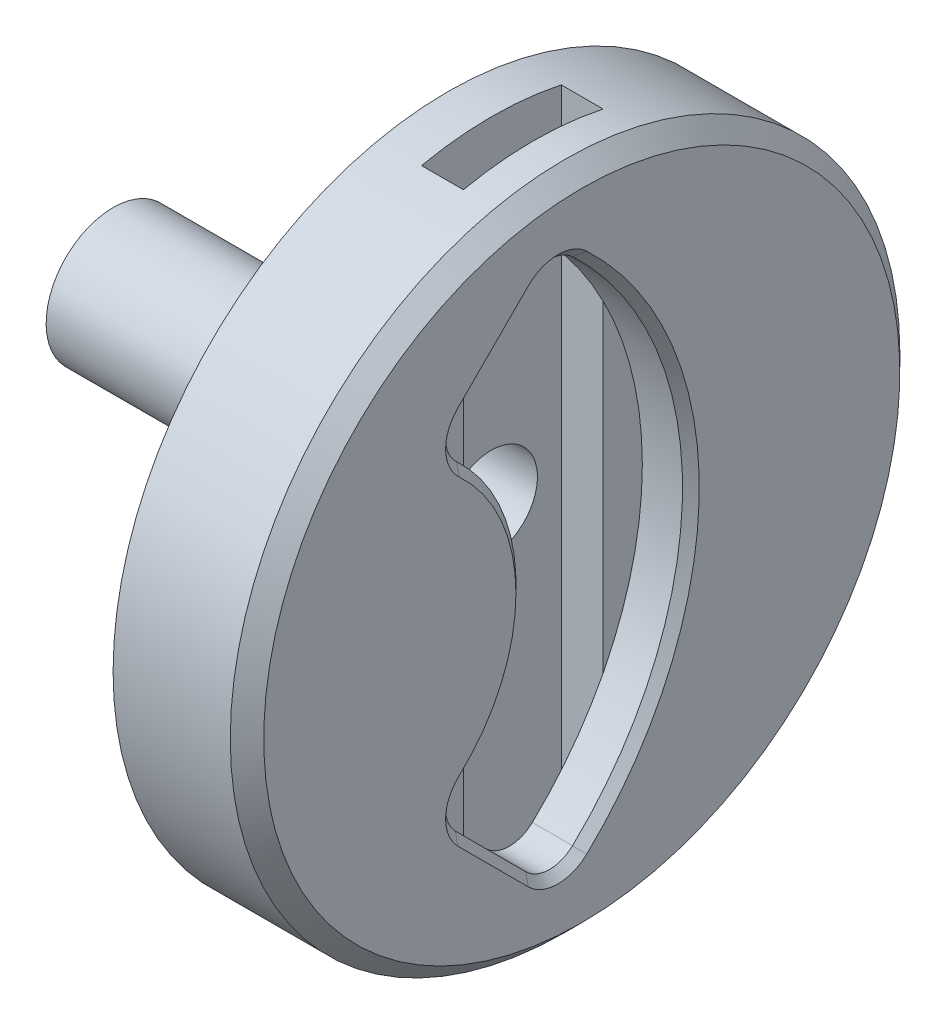
ISO-10303-21;
HEADER;
FILE_DESCRIPTION(('STEP AP214'),'2;1');
FILE_NAME('part.step','',(''),(''),'','','');
FILE_SCHEMA(('AUTOMOTIVE_DESIGN { 1 0 10303 214 1 1 1 1 }'));
ENDSEC;
DATA;
#1=APPLICATION_CONTEXT('core data for automotive mechanical design processes');
#2=APPLICATION_PROTOCOL_DEFINITION('international standard','automotive_design',2000,#1);
#3=PRODUCT_CONTEXT('',#1,'mechanical');
#4=PRODUCT('Part','Part','',(#3));
#5=PRODUCT_RELATED_PRODUCT_CATEGORY('part','',(#4));
#6=PRODUCT_DEFINITION_FORMATION('','',#4);
#7=PRODUCT_DEFINITION_CONTEXT('part definition',#1,'design');
#8=PRODUCT_DEFINITION('design','',#6,#7);
#9=PRODUCT_DEFINITION_SHAPE('','',#8);
#10=(LENGTH_UNIT() NAMED_UNIT(*) SI_UNIT(.MILLI.,.METRE.));
#11=(NAMED_UNIT(*) PLANE_ANGLE_UNIT() SI_UNIT($,.RADIAN.));
#12=(NAMED_UNIT(*) SI_UNIT($,.STERADIAN.) SOLID_ANGLE_UNIT());
#13=UNCERTAINTY_MEASURE_WITH_UNIT(LENGTH_MEASURE(1.E-05),#10,'distance_accuracy_value','');
#14=(GEOMETRIC_REPRESENTATION_CONTEXT(3) GLOBAL_UNCERTAINTY_ASSIGNED_CONTEXT((#13)) GLOBAL_UNIT_ASSIGNED_CONTEXT((#10,
#11,#12)) REPRESENTATION_CONTEXT('',''));
#15=CARTESIAN_POINT('',(0.,0.,0.));
#16=DIRECTION('',(0.,0.,1.));
#17=DIRECTION('',(1.,0.,0.));
#18=AXIS2_PLACEMENT_3D('',#15,#16,#17);
#19=CARTESIAN_POINT('',(5.1,-13.7799052524107,1.42498609336697));
#20=DIRECTION('',(-1.,0.,0.));
#21=DIRECTION('',(0.,-1.,0.));
#22=AXIS2_PLACEMENT_3D('',#19,#20,#21);
#23=PLANE('',#22);
#24=DIRECTION('',(0.,-0.707106781186549,-0.707106781186546));
#25=VECTOR('',#24,1.);
#26=CARTESIAN_POINT('',(5.1,-10.9842892389419,7.04902923158192));
#27=LINE('',#26,#25);
#28=CARTESIAN_POINT('',(5.1,-10.9842892389419,7.04902923158192));
#29=VERTEX_POINT('',#28);
#30=CARTESIAN_POINT('',(5.1,-13.8583184705238,4.175));
#31=VERTEX_POINT('',#30);
#32=EDGE_CURVE('E253',#29,#31,#27,.T.);
#33=ORIENTED_EDGE('',*,*,#32,.T.);
#34=DIRECTION('',(0.,1.,0.));
#35=VECTOR('',#34,1.);
#36=CARTESIAN_POINT('',(5.1,-25.,4.175));
#37=LINE('',#36,#35);
#38=CARTESIAN_POINT('',(5.1,-3.97075586725138,4.175));
#39=VERTEX_POINT('',#38);
#40=EDGE_CURVE('E477',#31,#39,#37,.T.);
#41=ORIENTED_EDGE('',*,*,#40,.T.);
#42=CARTESIAN_POINT('',(5.1,0.,14.4333184705237));
#43=DIRECTION('',(-1.,0.,0.));
#44=DIRECTION('',(0.,-1.,0.));
#45=AXIS2_PLACEMENT_3D('',#42,#43,#44);
#46=CIRCLE('',#45,11.);
#47=CARTESIAN_POINT('',(5.1,-8.09775634171204,6.98843148479573));
#48=VERTEX_POINT('',#47);
#49=EDGE_CURVE('E244',#39,#48,#46,.T.);
#50=ORIENTED_EDGE('',*,*,#49,.T.);
#51=CARTESIAN_POINT('',(5.1,-9.57007567656878,5.63481566920882));
#52=DIRECTION('',(1.,0.,0.));
#53=DIRECTION('',(0.,1.,0.));
#54=AXIS2_PLACEMENT_3D('',#51,#52,#53);
#55=CIRCLE('',#54,2.);
#56=EDGE_CURVE('E249',#48,#29,#55,.T.);
#57=ORIENTED_EDGE('',*,*,#56,.T.);
#58=EDGE_LOOP('',(#33,#41,#50,#57));
#59=FACE_BOUND('',#58,.T.);
#60=ADVANCED_FACE('F47',(#59),#23,.F.);
#61=DIRECTION('',(0.,1.,0.));
#62=VECTOR('',#61,1.);
#63=CARTESIAN_POINT('',(5.1,-25.,-4.175));
#64=LINE('',#63,#62);
#65=CARTESIAN_POINT('',(5.1,-9.62460304114226,-4.175));
#66=VERTEX_POINT('',#65);
#67=CARTESIAN_POINT('',(5.1,9.62460304114226,-4.175));
#68=VERTEX_POINT('',#67);
#69=EDGE_CURVE('E515',#66,#68,#64,.T.);
#70=ORIENTED_EDGE('',*,*,#69,.F.);
#71=CARTESIAN_POINT('',(5.1,0.,14.4333184705237));
#72=DIRECTION('',(1.,0.,0.));
#73=DIRECTION('',(0.,-1.,0.));
#74=AXIS2_PLACEMENT_3D('',#71,#72,#73);
#75=CIRCLE('',#74,20.95);
#76=EDGE_CURVE('E226',#66,#68,#75,.T.);
#77=ORIENTED_EDGE('',*,*,#76,.T.);
#78=EDGE_LOOP('',(#70,#77));
#79=FACE_BOUND('',#78,.T.);
#80=ADVANCED_FACE('F533',(#79),#23,.F.);
#81=CARTESIAN_POINT('',(-20.,0.,0.));
#82=DIRECTION('',(-1.,0.,0.));
#83=DIRECTION('',(0.,-1.,0.));
#84=AXIS2_PLACEMENT_3D('',#81,#82,#83);
#85=PLANE('',#84);
#86=CARTESIAN_POINT('',(-20.,0.,0.));
#87=DIRECTION('',(-1.,0.,0.));
#88=DIRECTION('',(0.,-1.,0.));
#89=AXIS2_PLACEMENT_3D('',#86,#87,#88);
#90=CIRCLE('',#89,1.75);
#91=CARTESIAN_POINT('',(-20.,-1.75,0.));
#92=VERTEX_POINT('',#91);
#93=EDGE_CURVE('E223',#92,#92,#90,.T.);
#94=ORIENTED_EDGE('',*,*,#93,.F.);
#95=EDGE_LOOP('',(#94));
#96=FACE_BOUND('',#95,.T.);
#97=CARTESIAN_POINT('',(-20.,0.,0.));
#98=DIRECTION('',(1.,0.,0.));
#99=DIRECTION('',(0.,1.,0.));
#100=AXIS2_PLACEMENT_3D('',#97,#98,#99);
#101=CIRCLE('',#100,4.);
#102=CARTESIAN_POINT('',(-20.,4.,0.));
#103=VERTEX_POINT('',#102);
#104=EDGE_CURVE('E298',#103,#103,#101,.T.);
#105=ORIENTED_EDGE('',*,*,#104,.F.);
#106=EDGE_LOOP('',(#105));
#107=FACE_BOUND('',#106,.T.);
#108=ADVANCED_FACE('F541',(#96,#107),#85,.T.);
#109=CARTESIAN_POINT('',(8.,0.,0.));
#110=DIRECTION('',(1.,0.,0.));
#111=DIRECTION('',(0.,1.,0.));
#112=AXIS2_PLACEMENT_3D('',#109,#110,#111);
#113=CYLINDRICAL_SURFACE('',#112,4.);
#114=CARTESIAN_POINT('',(-10.,0.,0.));
#115=DIRECTION('',(-1.,0.,0.));
#116=DIRECTION('',(0.,-1.,0.));
#117=AXIS2_PLACEMENT_3D('',#114,#115,#116);
#118=CIRCLE('',#117,4.);
#119=CARTESIAN_POINT('',(-10.,-4.,0.));
#120=VERTEX_POINT('',#119);
#121=EDGE_CURVE('E302',#120,#120,#118,.T.);
#122=ORIENTED_EDGE('',*,*,#121,.T.);
#123=EDGE_LOOP('',(#122));
#124=FACE_BOUND('',#123,.T.);
#125=ORIENTED_EDGE('',*,*,#104,.T.);
#126=EDGE_LOOP('',(#125));
#127=FACE_BOUND('',#126,.T.);
#128=ADVANCED_FACE('F571',(#124,#127),#113,.T.);
#129=CARTESIAN_POINT('',(0.,4.,0.));
#130=DIRECTION('',(-1.,0.,0.));
#131=DIRECTION('',(0.,-1.,0.));
#132=AXIS2_PLACEMENT_3D('',#129,#130,#131);
#133=PLANE('',#132);
#134=CARTESIAN_POINT('',(0.,0.,0.));
#135=DIRECTION('',(-1.,0.,0.));
#136=DIRECTION('',(0.,-1.,0.));
#137=AXIS2_PLACEMENT_3D('',#134,#135,#136);
#138=CIRCLE('',#137,14.);
#139=CARTESIAN_POINT('',(0.,-14.,0.));
#140=VERTEX_POINT('',#139);
#141=EDGE_CURVE('E297',#140,#140,#138,.F.);
#142=ORIENTED_EDGE('',*,*,#141,.T.);
#143=EDGE_LOOP('',(#142));
#144=FACE_BOUND('',#143,.T.);
#145=CARTESIAN_POINT('',(0.,0.,0.));
#146=DIRECTION('',(1.,0.,0.));
#147=DIRECTION('',(0.,1.,0.));
#148=AXIS2_PLACEMENT_3D('',#145,#146,#147);
#149=CIRCLE('',#148,20.);
#150=CARTESIAN_POINT('',(0.,20.,0.));
#151=VERTEX_POINT('',#150);
#152=EDGE_CURVE('E265',#151,#151,#149,.T.);
#153=ORIENTED_EDGE('',*,*,#152,.F.);
#154=EDGE_LOOP('',(#153));
#155=FACE_BOUND('',#154,.T.);
#156=ADVANCED_FACE('F568',(#144,#155),#133,.T.);
#157=CARTESIAN_POINT('',(8.,0.,0.));
#158=DIRECTION('',(1.,0.,0.));
#159=DIRECTION('',(0.,1.,0.));
#160=AXIS2_PLACEMENT_3D('',#157,#158,#159);
#161=CYLINDRICAL_SURFACE('',#160,20.);
#162=DIRECTION('',(1.,0.,0.));
#163=VECTOR('',#162,1.);
#164=CARTESIAN_POINT('',(8.00000000000001,-19.5593807417311,-4.175));
#165=LINE('',#164,#163);
#166=CARTESIAN_POINT('',(2.6,-19.5593807417311,-4.175));
#167=VERTEX_POINT('',#166);
#168=CARTESIAN_POINT('',(5.1,-19.5593807417311,-4.175));
#169=VERTEX_POINT('',#168);
#170=EDGE_CURVE('E195',#167,#169,#165,.T.);
#171=ORIENTED_EDGE('',*,*,#170,.F.);
#172=CARTESIAN_POINT('',(2.6,0.,0.));
#173=DIRECTION('',(-1.,0.,0.));
#174=DIRECTION('',(0.,0.,1.));
#175=AXIS2_PLACEMENT_3D('',#172,#173,#174);
#176=CIRCLE('',#175,20.);
#177=CARTESIAN_POINT('',(2.6,-19.5593807417311,4.175));
#178=VERTEX_POINT('',#177);
#179=EDGE_CURVE('E179',#178,#167,#176,.F.);
#180=ORIENTED_EDGE('',*,*,#179,.F.);
#181=DIRECTION('',(1.,0.,0.));
#182=VECTOR('',#181,1.);
#183=CARTESIAN_POINT('',(8.00000000000001,-19.5593807417311,4.175));
#184=LINE('',#183,#182);
#185=CARTESIAN_POINT('',(5.1,-19.5593807417311,4.175));
#186=VERTEX_POINT('',#185);
#187=EDGE_CURVE('E202',#186,#178,#184,.F.);
#188=ORIENTED_EDGE('',*,*,#187,.F.);
#189=CARTESIAN_POINT('',(5.1,0.,0.));
#190=DIRECTION('',(1.,0.,0.));
#191=DIRECTION('',(0.,0.,-1.));
#192=AXIS2_PLACEMENT_3D('',#189,#190,#191);
#193=CIRCLE('',#192,20.);
#194=EDGE_CURVE('E201',#169,#186,#193,.F.);
#195=ORIENTED_EDGE('',*,*,#194,.F.);
#196=EDGE_LOOP('',(#171,#180,#188,#195));
#197=FACE_BOUND('',#196,.T.);
#198=DIRECTION('',(1.,0.,0.));
#199=VECTOR('',#198,1.);
#200=CARTESIAN_POINT('',(8.,19.5593807417311,-4.175));
#201=LINE('',#200,#199);
#202=CARTESIAN_POINT('',(5.1,19.5593807417311,-4.175));
#203=VERTEX_POINT('',#202);
#204=CARTESIAN_POINT('',(2.6,19.5593807417311,-4.175));
#205=VERTEX_POINT('',#204);
#206=EDGE_CURVE('E196',#203,#205,#201,.F.);
#207=ORIENTED_EDGE('',*,*,#206,.F.);
#208=CARTESIAN_POINT('',(5.1,19.5593807417311,4.175));
#209=VERTEX_POINT('',#208);
#210=EDGE_CURVE('E190',#209,#203,#193,.F.);
#211=ORIENTED_EDGE('',*,*,#210,.F.);
#212=DIRECTION('',(1.,0.,0.));
#213=VECTOR('',#212,1.);
#214=CARTESIAN_POINT('',(8.,19.5593807417311,4.175));
#215=LINE('',#214,#213);
#216=CARTESIAN_POINT('',(2.6,19.5593807417311,4.175));
#217=VERTEX_POINT('',#216);
#218=EDGE_CURVE('E212',#217,#209,#215,.T.);
#219=ORIENTED_EDGE('',*,*,#218,.F.);
#220=EDGE_CURVE('E189',#205,#217,#176,.F.);
#221=ORIENTED_EDGE('',*,*,#220,.F.);
#222=EDGE_LOOP('',(#207,#211,#219,#221));
#223=FACE_BOUND('',#222,.T.);
#224=CARTESIAN_POINT('',(7.,0.,0.));
#225=DIRECTION('',(1.,0.,0.));
#226=DIRECTION('',(0.,1.,0.));
#227=AXIS2_PLACEMENT_3D('',#224,#225,#226);
#228=CIRCLE('',#227,20.);
#229=CARTESIAN_POINT('',(7.,20.,0.));
#230=VERTEX_POINT('',#229);
#231=EDGE_CURVE('E314',#230,#230,#228,.F.);
#232=ORIENTED_EDGE('',*,*,#231,.T.);
#233=EDGE_LOOP('',(#232));
#234=FACE_BOUND('',#233,.T.);
#235=ORIENTED_EDGE('',*,*,#152,.T.);
#236=EDGE_LOOP('',(#235));
#237=FACE_BOUND('',#236,.T.);
#238=ADVANCED_FACE('F203',(#197,#223,#234,#237),#161,.T.);
#239=CARTESIAN_POINT('',(8.,20.,0.));
#240=DIRECTION('',(1.,0.,0.));
#241=DIRECTION('',(0.,1.,0.));
#242=AXIS2_PLACEMENT_3D('',#239,#240,#241);
#243=PLANE('',#242);
#244=CARTESIAN_POINT('',(8.,-9.57007567656878,5.63481566920882));
#245=DIRECTION('',(1.,0.,0.));
#246=DIRECTION('',(0.,1.,0.));
#247=AXIS2_PLACEMENT_3D('',#244,#245,#246);
#248=CIRCLE('',#247,2.5);
#249=CARTESIAN_POINT('',(8.,-11.3378426295351,7.40258262217519));
#250=VERTEX_POINT('',#249);
#251=CARTESIAN_POINT('',(8.,-7.72967650799785,7.32683543869246));
#252=VERTEX_POINT('',#251);
#253=EDGE_CURVE('E342',#250,#252,#248,.F.);
#254=ORIENTED_EDGE('',*,*,#253,.T.);
#255=CARTESIAN_POINT('',(8.,0.,14.4333184705237));
#256=DIRECTION('',(1.,0.,0.));
#257=DIRECTION('',(0.,1.,0.));
#258=AXIS2_PLACEMENT_3D('',#255,#256,#257);
#259=CIRCLE('',#258,10.5);
#260=CARTESIAN_POINT('',(8.,7.72967650799786,7.32683543869246));
#261=VERTEX_POINT('',#260);
#262=EDGE_CURVE('E341',#252,#261,#259,.T.);
#263=ORIENTED_EDGE('',*,*,#262,.T.);
#264=CARTESIAN_POINT('',(8.,9.57007567656878,5.63481566920882));
#265=DIRECTION('',(1.,0.,0.));
#266=DIRECTION('',(0.,1.,0.));
#267=AXIS2_PLACEMENT_3D('',#264,#265,#266);
#268=CIRCLE('',#267,2.5);
#269=CARTESIAN_POINT('',(8.,11.3378426295351,7.4025826221752));
#270=VERTEX_POINT('',#269);
#271=EDGE_CURVE('E336',#261,#270,#268,.F.);
#272=ORIENTED_EDGE('',*,*,#271,.T.);
#273=DIRECTION('',(0.,0.707106781186549,-0.707106781186546));
#274=VECTOR('',#273,1.);
#275=CARTESIAN_POINT('',(8.,15.547672205377,3.19275304633334));
#276=LINE('',#275,#274);
#277=CARTESIAN_POINT('',(8.,15.547672205377,3.19275304633334));
#278=VERTEX_POINT('',#277);
#279=EDGE_CURVE('E335',#270,#278,#276,.T.);
#280=ORIENTED_EDGE('',*,*,#279,.T.);
#281=CARTESIAN_POINT('',(8.,13.7799052524107,1.42498609336697));
#282=DIRECTION('',(1.,0.,0.));
#283=DIRECTION('',(0.,1.,0.));
#284=AXIS2_PLACEMENT_3D('',#281,#282,#283);
#285=CIRCLE('',#284,2.5);
#286=CARTESIAN_POINT('',(8.,15.5978347052353,-0.291152742669542));
#287=VERTEX_POINT('',#286);
#288=EDGE_CURVE('E326',#278,#287,#285,.F.);
#289=ORIENTED_EDGE('',*,*,#288,.T.);
#290=CARTESIAN_POINT('',(8.,0.,14.4333184705237));
#291=DIRECTION('',(1.,0.,0.));
#292=DIRECTION('',(0.,1.,0.));
#293=AXIS2_PLACEMENT_3D('',#290,#291,#292);
#294=CIRCLE('',#293,21.45);
#295=CARTESIAN_POINT('',(8.00000000000001,-15.5978347052353,-0.29115274266955));
#296=VERTEX_POINT('',#295);
#297=EDGE_CURVE('E324',#287,#296,#294,.F.);
#298=ORIENTED_EDGE('',*,*,#297,.T.);
#299=CARTESIAN_POINT('',(8.,-13.7799052524107,1.42498609336697));
#300=DIRECTION('',(1.,0.,0.));
#301=DIRECTION('',(0.,1.,0.));
#302=AXIS2_PLACEMENT_3D('',#299,#300,#301);
#303=CIRCLE('',#302,2.5);
#304=CARTESIAN_POINT('',(8.00000000000001,-15.547672205377,3.19275304633334));
#305=VERTEX_POINT('',#304);
#306=EDGE_CURVE('E328',#296,#305,#303,.F.);
#307=ORIENTED_EDGE('',*,*,#306,.T.);
#308=DIRECTION('',(0.,0.707106781186549,0.707106781186546));
#309=VECTOR('',#308,1.);
#310=CARTESIAN_POINT('',(8.,-11.3378426295351,7.40258262217519));
#311=LINE('',#310,#309);
#312=EDGE_CURVE('E332',#305,#250,#311,.T.);
#313=ORIENTED_EDGE('',*,*,#312,.T.);
#314=EDGE_LOOP('',(#254,#263,#272,#280,#289,#298,#307,#313));
#315=FACE_BOUND('',#314,.T.);
#316=CARTESIAN_POINT('',(8.,0.,0.));
#317=DIRECTION('',(1.,0.,0.));
#318=DIRECTION('',(0.,1.,0.));
#319=AXIS2_PLACEMENT_3D('',#316,#317,#318);
#320=CIRCLE('',#319,19.);
#321=CARTESIAN_POINT('',(8.,19.,0.));
#322=VERTEX_POINT('',#321);
#323=EDGE_CURVE('E308',#322,#322,#320,.T.);
#324=ORIENTED_EDGE('',*,*,#323,.T.);
#325=EDGE_LOOP('',(#324));
#326=FACE_BOUND('',#325,.T.);
#327=ADVANCED_FACE('F401',(#315,#326),#243,.T.);
#328=CARTESIAN_POINT('',(5.1,-13.7799052524107,1.42498609336697));
#329=DIRECTION('',(1.,0.,0.));
#330=DIRECTION('',(0.,1.,0.));
#331=AXIS2_PLACEMENT_3D('',#328,#329,#330);
#332=CYLINDRICAL_SURFACE('',#331,2.);
#333=DIRECTION('',(1.,0.,0.));
#334=VECTOR('',#333,1.);
#335=CARTESIAN_POINT('',(5.1,-15.1941188147837,2.83919965574006));
#336=LINE('',#335,#334);
#337=CARTESIAN_POINT('',(5.1,-15.1941188147837,2.83919965574006));
#338=VERTEX_POINT('',#337);
#339=CARTESIAN_POINT('',(7.49999999999999,-15.1941188147837,2.83919965574006));
#340=VERTEX_POINT('',#339);
#341=EDGE_CURVE('E261',#338,#340,#336,.T.);
#342=ORIENTED_EDGE('',*,*,#341,.T.);
#343=CARTESIAN_POINT('',(7.49999999999999,-13.7799052524107,1.42498609336697));
#344=DIRECTION('',(1.,0.,0.));
#345=DIRECTION('',(0.,0.,-1.));
#346=AXIS2_PLACEMENT_3D('',#343,#344,#345);
#347=CIRCLE('',#346,2.);
#348=CARTESIAN_POINT('',(7.49999999999999,-15.2342488146703,0.0520750245377542));
#349=VERTEX_POINT('',#348);
#350=EDGE_CURVE('E359',#340,#349,#347,.T.);
#351=ORIENTED_EDGE('',*,*,#350,.T.);
#352=DIRECTION('',(1.,0.,0.));
#353=VECTOR('',#352,1.);
#354=CARTESIAN_POINT('',(5.1,-15.2342488146703,0.0520750245377542));
#355=LINE('',#354,#353);
#356=CARTESIAN_POINT('',(5.1,-15.2342488146703,0.0520750245377542));
#357=VERTEX_POINT('',#356);
#358=EDGE_CURVE('E256',#357,#349,#355,.T.);
#359=ORIENTED_EDGE('',*,*,#358,.F.);
#360=CARTESIAN_POINT('',(5.1,-13.7799052524107,1.42498609336697));
#361=DIRECTION('',(1.,0.,0.));
#362=DIRECTION('',(0.,-1.,0.));
#363=AXIS2_PLACEMENT_3D('',#360,#361,#362);
#364=CIRCLE('',#363,2.);
#365=EDGE_CURVE('E222',#338,#357,#364,.T.);
#366=ORIENTED_EDGE('',*,*,#365,.F.);
#367=EDGE_LOOP('',(#342,#351,#359,#366));
#368=FACE_BOUND('',#367,.T.);
#369=ADVANCED_FACE('F448',(#368),#332,.F.);
#370=CARTESIAN_POINT('',(5.1,-10.9842892389419,7.04902923158192));
#371=DIRECTION('',(0.,-0.707106781186546,0.707106781186549));
#372=DIRECTION('',(0.,-0.707106781186549,-0.707106781186546));
#373=AXIS2_PLACEMENT_3D('',#370,#371,#372);
#374=PLANE('',#373);
#375=DIRECTION('',(1.,0.,0.));
#376=VECTOR('',#375,1.);
#377=CARTESIAN_POINT('',(5.1,-10.9842892389419,7.04902923158192));
#378=LINE('',#377,#376);
#379=CARTESIAN_POINT('',(7.49999999999999,-10.9842892389419,7.04902923158192));
#380=VERTEX_POINT('',#379);
#381=EDGE_CURVE('E268',#29,#380,#378,.T.);
#382=ORIENTED_EDGE('',*,*,#381,.T.);
#383=DIRECTION('',(0.,-0.707106781186549,-0.707106781186546));
#384=VECTOR('',#383,1.);
#385=CARTESIAN_POINT('',(7.49999999999999,-15.1941188147837,2.83919965574006));
#386=LINE('',#385,#384);
#387=EDGE_CURVE('E354',#380,#340,#386,.T.);
#388=ORIENTED_EDGE('',*,*,#387,.T.);
#389=ORIENTED_EDGE('',*,*,#341,.F.);
#390=EDGE_CURVE('E258',#31,#338,#27,.T.);
#391=ORIENTED_EDGE('',*,*,#390,.F.);
#392=ORIENTED_EDGE('',*,*,#32,.F.);
#393=EDGE_LOOP('',(#382,#388,#389,#391,#392));
#394=FACE_BOUND('',#393,.T.);
#395=ADVANCED_FACE('F474',(#394),#374,.F.);
#396=CARTESIAN_POINT('',(5.1,-9.57007567656878,5.63481566920882));
#397=DIRECTION('',(1.,0.,0.));
#398=DIRECTION('',(0.,1.,0.));
#399=AXIS2_PLACEMENT_3D('',#396,#397,#398);
#400=CYLINDRICAL_SURFACE('',#399,2.);
#401=DIRECTION('',(1.,0.,0.));
#402=VECTOR('',#401,1.);
#403=CARTESIAN_POINT('',(5.1,-8.09775634171204,6.98843148479573));
#404=LINE('',#403,#402);
#405=CARTESIAN_POINT('',(7.49999999999999,-8.09775634171204,6.98843148479573));
#406=VERTEX_POINT('',#405);
#407=EDGE_CURVE('E267',#48,#406,#404,.T.);
#408=ORIENTED_EDGE('',*,*,#407,.T.);
#409=CARTESIAN_POINT('',(7.49999999999999,-9.57007567656878,5.63481566920882));
#410=DIRECTION('',(1.,0.,0.));
#411=DIRECTION('',(0.,0.,-1.));
#412=AXIS2_PLACEMENT_3D('',#409,#410,#411);
#413=CIRCLE('',#412,2.);
#414=EDGE_CURVE('E349',#406,#380,#413,.T.);
#415=ORIENTED_EDGE('',*,*,#414,.T.);
#416=ORIENTED_EDGE('',*,*,#381,.F.);
#417=ORIENTED_EDGE('',*,*,#56,.F.);
#418=EDGE_LOOP('',(#408,#415,#416,#417));
#419=FACE_BOUND('',#418,.T.);
#420=ADVANCED_FACE('F469',(#419),#400,.F.);
#421=CARTESIAN_POINT('',(5.1,0.,14.4333184705237));
#422=DIRECTION('',(1.,0.,0.));
#423=DIRECTION('',(0.,1.,0.));
#424=AXIS2_PLACEMENT_3D('',#421,#422,#423);
#425=CYLINDRICAL_SURFACE('',#424,11.);
#426=DIRECTION('',(1.,0.,0.));
#427=VECTOR('',#426,1.);
#428=CARTESIAN_POINT('',(5.1,8.09775634171204,6.98843148479573));
#429=LINE('',#428,#427);
#430=CARTESIAN_POINT('',(5.1,8.09775634171204,6.98843148479573));
#431=VERTEX_POINT('',#430);
#432=CARTESIAN_POINT('',(7.49999999999999,8.09775634171204,6.98843148479573));
#433=VERTEX_POINT('',#432);
#434=EDGE_CURVE('E274',#431,#433,#429,.T.);
#435=ORIENTED_EDGE('',*,*,#434,.T.);
#436=CARTESIAN_POINT('',(7.49999999999999,0.,14.4333184705237));
#437=DIRECTION('',(1.,0.,0.));
#438=DIRECTION('',(0.,1.,0.));
#439=AXIS2_PLACEMENT_3D('',#436,#437,#438);
#440=CIRCLE('',#439,11.);
#441=EDGE_CURVE('E316',#433,#406,#440,.F.);
#442=ORIENTED_EDGE('',*,*,#441,.T.);
#443=ORIENTED_EDGE('',*,*,#407,.F.);
#444=ORIENTED_EDGE('',*,*,#49,.F.);
#445=CARTESIAN_POINT('',(5.1,3.97075586725138,4.175));
#446=VERTEX_POINT('',#445);
#447=EDGE_CURVE('E252',#446,#39,#46,.T.);
#448=ORIENTED_EDGE('',*,*,#447,.F.);
#449=EDGE_CURVE('E246',#431,#446,#46,.T.);
#450=ORIENTED_EDGE('',*,*,#449,.F.);
#451=EDGE_LOOP('',(#435,#442,#443,#444,#448,#450));
#452=FACE_BOUND('',#451,.T.);
#453=ADVANCED_FACE('F421',(#452),#425,.T.);
#454=CARTESIAN_POINT('',(5.1,9.57007567656878,5.63481566920882));
#455=DIRECTION('',(1.,0.,0.));
#456=DIRECTION('',(0.,1.,0.));
#457=AXIS2_PLACEMENT_3D('',#454,#455,#456);
#458=CYLINDRICAL_SURFACE('',#457,2.);
#459=DIRECTION('',(1.,0.,0.));
#460=VECTOR('',#459,1.);
#461=CARTESIAN_POINT('',(5.1,10.9842892389419,7.04902923158192));
#462=LINE('',#461,#460);
#463=CARTESIAN_POINT('',(5.1,10.9842892389419,7.04902923158192));
#464=VERTEX_POINT('',#463);
#465=CARTESIAN_POINT('',(7.49999999999999,10.9842892389419,7.04902923158192));
#466=VERTEX_POINT('',#465);
#467=EDGE_CURVE('E279',#464,#466,#462,.T.);
#468=ORIENTED_EDGE('',*,*,#467,.T.);
#469=CARTESIAN_POINT('',(7.49999999999999,9.57007567656878,5.63481566920882));
#470=DIRECTION('',(1.,0.,0.));
#471=DIRECTION('',(0.,0.,-1.));
#472=AXIS2_PLACEMENT_3D('',#469,#470,#471);
#473=CIRCLE('',#472,2.);
#474=EDGE_CURVE('E353',#466,#433,#473,.T.);
#475=ORIENTED_EDGE('',*,*,#474,.T.);
#476=ORIENTED_EDGE('',*,*,#434,.F.);
#477=CARTESIAN_POINT('',(5.1,9.57007567656878,5.63481566920882));
#478=DIRECTION('',(1.,0.,0.));
#479=DIRECTION('',(0.,-1.,0.));
#480=AXIS2_PLACEMENT_3D('',#477,#478,#479);
#481=CIRCLE('',#480,2.);
#482=EDGE_CURVE('E241',#464,#431,#481,.T.);
#483=ORIENTED_EDGE('',*,*,#482,.F.);
#484=EDGE_LOOP('',(#468,#475,#476,#483));
#485=FACE_BOUND('',#484,.T.);
#486=ADVANCED_FACE('F416',(#485),#458,.F.);
#487=CARTESIAN_POINT('',(5.1,15.1941188147837,2.83919965574006));
#488=DIRECTION('',(0.,0.707106781186546,0.707106781186549));
#489=DIRECTION('',(0.,-0.707106781186549,0.707106781186546));
#490=AXIS2_PLACEMENT_3D('',#487,#488,#489);
#491=PLANE('',#490);
#492=DIRECTION('',(1.,0.,0.));
#493=VECTOR('',#492,1.);
#494=CARTESIAN_POINT('',(5.1,15.1941188147837,2.83919965574006));
#495=LINE('',#494,#493);
#496=CARTESIAN_POINT('',(5.1,15.1941188147837,2.83919965574006));
#497=VERTEX_POINT('',#496);
#498=CARTESIAN_POINT('',(7.49999999999999,15.1941188147837,2.83919965574006));
#499=VERTEX_POINT('',#498);
#500=EDGE_CURVE('E282',#497,#499,#495,.T.);
#501=ORIENTED_EDGE('',*,*,#500,.T.);
#502=DIRECTION('',(0.,-0.707106781186549,0.707106781186546));
#503=VECTOR('',#502,1.);
#504=CARTESIAN_POINT('',(7.49999999999999,10.9842892389419,7.04902923158192));
#505=LINE('',#504,#503);
#506=EDGE_CURVE('E357',#499,#466,#505,.T.);
#507=ORIENTED_EDGE('',*,*,#506,.T.);
#508=ORIENTED_EDGE('',*,*,#467,.F.);
#509=DIRECTION('',(0.,-0.707106781186549,0.707106781186546));
#510=VECTOR('',#509,1.);
#511=CARTESIAN_POINT('',(5.1,15.1941188147837,2.83919965574006));
#512=LINE('',#511,#510);
#513=CARTESIAN_POINT('',(5.1,13.8583184705238,4.175));
#514=VERTEX_POINT('',#513);
#515=EDGE_CURVE('E240',#514,#464,#512,.T.);
#516=ORIENTED_EDGE('',*,*,#515,.F.);
#517=EDGE_CURVE('E238',#497,#514,#512,.T.);
#518=ORIENTED_EDGE('',*,*,#517,.F.);
#519=EDGE_LOOP('',(#501,#507,#508,#516,#518));
#520=FACE_BOUND('',#519,.T.);
#521=ADVANCED_FACE('F434',(#520),#491,.F.);
#522=CARTESIAN_POINT('',(5.1,13.7799052524107,1.42498609336697));
#523=DIRECTION('',(1.,0.,0.));
#524=DIRECTION('',(0.,1.,0.));
#525=AXIS2_PLACEMENT_3D('',#522,#523,#524);
#526=CYLINDRICAL_SURFACE('',#525,2.);
#527=DIRECTION('',(1.,0.,0.));
#528=VECTOR('',#527,1.);
#529=CARTESIAN_POINT('',(5.1,15.2342488146704,0.0520750245377594));
#530=LINE('',#529,#528);
#531=CARTESIAN_POINT('',(5.1,15.2342488146704,0.0520750245377594));
#532=VERTEX_POINT('',#531);
#533=CARTESIAN_POINT('',(7.49999999999999,15.2342488146704,0.0520750245377594));
#534=VERTEX_POINT('',#533);
#535=EDGE_CURVE('E288',#532,#534,#530,.T.);
#536=ORIENTED_EDGE('',*,*,#535,.T.);
#537=CARTESIAN_POINT('',(7.49999999999999,13.7799052524107,1.42498609336697));
#538=DIRECTION('',(1.,0.,0.));
#539=DIRECTION('',(0.,0.,-1.));
#540=AXIS2_PLACEMENT_3D('',#537,#538,#539);
#541=CIRCLE('',#540,2.);
#542=EDGE_CURVE('E58',#534,#499,#541,.T.);
#543=ORIENTED_EDGE('',*,*,#542,.T.);
#544=ORIENTED_EDGE('',*,*,#500,.F.);
#545=CARTESIAN_POINT('',(5.1,13.7799052524107,1.42498609336697));
#546=DIRECTION('',(1.,0.,0.));
#547=DIRECTION('',(0.,1.,0.));
#548=AXIS2_PLACEMENT_3D('',#545,#546,#547);
#549=CIRCLE('',#548,2.);
#550=EDGE_CURVE('E231',#532,#497,#549,.T.);
#551=ORIENTED_EDGE('',*,*,#550,.F.);
#552=EDGE_LOOP('',(#536,#543,#544,#551));
#553=FACE_BOUND('',#552,.T.);
#554=ADVANCED_FACE('F437',(#553),#526,.F.);
#555=CARTESIAN_POINT('',(5.1,0.,14.4333184705237));
#556=DIRECTION('',(1.,0.,0.));
#557=DIRECTION('',(0.,1.,0.));
#558=AXIS2_PLACEMENT_3D('',#555,#556,#557);
#559=CYLINDRICAL_SURFACE('',#558,20.95);
#560=ORIENTED_EDGE('',*,*,#358,.T.);
#561=CARTESIAN_POINT('',(7.49999999999999,0.,14.4333184705237));
#562=DIRECTION('',(1.,0.,0.));
#563=DIRECTION('',(0.,1.,0.));
#564=AXIS2_PLACEMENT_3D('',#561,#562,#563);
#565=CIRCLE('',#564,20.95);
#566=EDGE_CURVE('E12',#349,#534,#565,.T.);
#567=ORIENTED_EDGE('',*,*,#566,.T.);
#568=ORIENTED_EDGE('',*,*,#535,.F.);
#569=EDGE_CURVE('E234',#68,#532,#75,.T.);
#570=ORIENTED_EDGE('',*,*,#569,.F.);
#571=ORIENTED_EDGE('',*,*,#76,.F.);
#572=EDGE_CURVE('E230',#357,#66,#75,.T.);
#573=ORIENTED_EDGE('',*,*,#572,.F.);
#574=EDGE_LOOP('',(#560,#567,#568,#570,#571,#573));
#575=FACE_BOUND('',#574,.T.);
#576=ADVANCED_FACE('F442',(#575),#559,.F.);
#577=ORIENTED_EDGE('',*,*,#449,.T.);
#578=EDGE_CURVE('E431',#446,#514,#37,.T.);
#579=ORIENTED_EDGE('',*,*,#578,.T.);
#580=ORIENTED_EDGE('',*,*,#515,.T.);
#581=ORIENTED_EDGE('',*,*,#482,.T.);
#582=EDGE_LOOP('',(#577,#579,#580,#581));
#583=FACE_BOUND('',#582,.T.);
#584=ADVANCED_FACE('F429',(#583),#23,.F.);
#585=CARTESIAN_POINT('',(-10.,0.,0.));
#586=DIRECTION('',(-1.,0.,0.));
#587=DIRECTION('',(0.,-1.,0.));
#588=AXIS2_PLACEMENT_3D('',#585,#586,#587);
#589=TOROIDAL_SURFACE('',#588,14.,10.);
#590=ORIENTED_EDGE('',*,*,#121,.F.);
#591=EDGE_LOOP('',(#590));
#592=FACE_BOUND('',#591,.T.);
#593=ORIENTED_EDGE('',*,*,#141,.F.);
#594=EDGE_LOOP('',(#593));
#595=FACE_BOUND('',#594,.T.);
#596=ADVANCED_FACE('F548',(#592,#595),#589,.F.);
#597=CARTESIAN_POINT('',(8.00100000000001,0.,0.));
#598=DIRECTION('',(-1.,0.,0.));
#599=DIRECTION('',(0.,-1.,0.));
#600=AXIS2_PLACEMENT_3D('',#597,#598,#599);
#601=CYLINDRICAL_SURFACE('',#600,1.75);
#602=CARTESIAN_POINT('',(-17.,0.,0.));
#603=DIRECTION('',(-1.,0.,0.));
#604=DIRECTION('',(0.,-1.,0.));
#605=AXIS2_PLACEMENT_3D('',#602,#603,#604);
#606=CIRCLE('',#605,1.75);
#607=CARTESIAN_POINT('',(-17.,-1.75,0.));
#608=VERTEX_POINT('',#607);
#609=EDGE_CURVE('E218',#608,#608,#606,.F.);
#610=ORIENTED_EDGE('',*,*,#609,.T.);
#611=EDGE_LOOP('',(#610));
#612=FACE_BOUND('',#611,.T.);
#613=ORIENTED_EDGE('',*,*,#93,.T.);
#614=EDGE_LOOP('',(#613));
#615=FACE_BOUND('',#614,.T.);
#616=ADVANCED_FACE('F552',(#612,#615),#601,.F.);
#617=CARTESIAN_POINT('',(-17.,0.,0.));
#618=DIRECTION('',(-1.,0.,0.));
#619=DIRECTION('',(0.,-1.,0.));
#620=AXIS2_PLACEMENT_3D('',#617,#618,#619);
#621=PLANE('',#620);
#622=CARTESIAN_POINT('',(-17.,0.,0.));
#623=DIRECTION('',(-1.,0.,0.));
#624=DIRECTION('',(0.,-1.,0.));
#625=AXIS2_PLACEMENT_3D('',#622,#623,#624);
#626=CIRCLE('',#625,2.75);
#627=CARTESIAN_POINT('',(-17.,-2.75,0.));
#628=VERTEX_POINT('',#627);
#629=EDGE_CURVE('E213',#628,#628,#626,.F.);
#630=ORIENTED_EDGE('',*,*,#629,.T.);
#631=EDGE_LOOP('',(#630));
#632=FACE_BOUND('',#631,.T.);
#633=ORIENTED_EDGE('',*,*,#609,.F.);
#634=EDGE_LOOP('',(#633));
#635=FACE_BOUND('',#634,.T.);
#636=ADVANCED_FACE('F656',(#632,#635),#621,.F.);
#637=CARTESIAN_POINT('',(-27.778174593052,0.,0.));
#638=DIRECTION('',(1.,0.,0.));
#639=DIRECTION('',(0.,1.,0.));
#640=AXIS2_PLACEMENT_3D('',#637,#638,#639);
#641=CYLINDRICAL_SURFACE('',#640,2.75);
#642=CARTESIAN_POINT('',(2.6,0.,0.));
#643=DIRECTION('',(-1.,0.,0.));
#644=DIRECTION('',(0.,0.,1.));
#645=AXIS2_PLACEMENT_3D('',#642,#643,#644);
#646=CIRCLE('',#645,2.75);
#647=CARTESIAN_POINT('',(2.6,0.,2.75));
#648=VERTEX_POINT('',#647);
#649=EDGE_CURVE('E53',#648,#648,#646,.F.);
#650=ORIENTED_EDGE('',*,*,#649,.T.);
#651=EDGE_LOOP('',(#650));
#652=FACE_BOUND('',#651,.T.);
#653=ORIENTED_EDGE('',*,*,#629,.F.);
#654=EDGE_LOOP('',(#653));
#655=FACE_BOUND('',#654,.T.);
#656=ADVANCED_FACE('F583',(#652,#655),#641,.F.);
#657=CARTESIAN_POINT('',(8.,0.,0.));
#658=DIRECTION('',(-1.,0.,0.));
#659=DIRECTION('',(0.,-1.,0.));
#660=AXIS2_PLACEMENT_3D('',#657,#658,#659);
#661=CONICAL_SURFACE('',#660,19.,0.785398163397449);
#662=ORIENTED_EDGE('',*,*,#231,.F.);
#663=EDGE_LOOP('',(#662));
#664=FACE_BOUND('',#663,.T.);
#665=ORIENTED_EDGE('',*,*,#323,.F.);
#666=EDGE_LOOP('',(#665));
#667=FACE_BOUND('',#666,.T.);
#668=ADVANCED_FACE('F578',(#664,#667),#661,.T.);
#669=CARTESIAN_POINT('',(7.49999999999999,0.,14.4333184705237));
#670=DIRECTION('',(1.,0.,0.));
#671=DIRECTION('',(0.,1.,0.));
#672=AXIS2_PLACEMENT_3D('',#669,#670,#671);
#673=CONICAL_SURFACE('',#672,20.95,0.785398163397437);
#674=DIRECTION('',(-0.707106781186554,0.514188097524412,0.485397363367598));
#675=VECTOR('',#674,1.);
#676=CARTESIAN_POINT('',(8.00000000000001,-15.5978347052353,-0.29115274266955));
#677=LINE('',#676,#675);
#678=EDGE_CURVE('E387',#296,#349,#677,.T.);
#679=ORIENTED_EDGE('',*,*,#678,.F.);
#680=ORIENTED_EDGE('',*,*,#297,.F.);
#681=DIRECTION('',(0.707106781186554,0.514188097524414,-0.485397363367596));
#682=VECTOR('',#681,1.);
#683=CARTESIAN_POINT('',(7.49999999999999,15.2342488146704,0.05207502453776));
#684=LINE('',#683,#682);
#685=EDGE_CURVE('E220',#534,#287,#684,.T.);
#686=ORIENTED_EDGE('',*,*,#685,.F.);
#687=ORIENTED_EDGE('',*,*,#566,.F.);
#688=EDGE_LOOP('',(#679,#680,#686,#687));
#689=FACE_BOUND('',#688,.T.);
#690=ADVANCED_FACE('F55',(#689),#673,.F.);
#691=CARTESIAN_POINT('',(7.49999999999999,13.7799052524107,1.42498609336697));
#692=DIRECTION('',(1.,0.,0.));
#693=DIRECTION('',(0.,0.,-1.));
#694=AXIS2_PLACEMENT_3D('',#691,#692,#693);
#695=CONICAL_SURFACE('',#694,2.,0.785398163397439);
#696=ORIENTED_EDGE('',*,*,#685,.T.);
#697=ORIENTED_EDGE('',*,*,#288,.F.);
#698=DIRECTION('',(0.707106781186554,0.499999999999995,0.499999999999996));
#699=VECTOR('',#698,1.);
#700=CARTESIAN_POINT('',(7.49999999999999,15.1941188147837,2.83919965574006));
#701=LINE('',#700,#699);
#702=EDGE_CURVE('E385',#499,#278,#701,.T.);
#703=ORIENTED_EDGE('',*,*,#702,.F.);
#704=ORIENTED_EDGE('',*,*,#542,.F.);
#705=EDGE_LOOP('',(#696,#697,#703,#704));
#706=FACE_BOUND('',#705,.T.);
#707=ADVANCED_FACE('F395',(#706),#695,.F.);
#708=CARTESIAN_POINT('',(7.49999999999999,-13.7799052524107,1.42498609336697));
#709=DIRECTION('',(1.,0.,0.));
#710=DIRECTION('',(0.,0.,-1.));
#711=AXIS2_PLACEMENT_3D('',#708,#709,#710);
#712=CONICAL_SURFACE('',#711,2.,0.785398163397439);
#713=ORIENTED_EDGE('',*,*,#678,.T.);
#714=ORIENTED_EDGE('',*,*,#350,.F.);
#715=DIRECTION('',(-0.707106781186554,0.499999999999996,-0.499999999999995));
#716=VECTOR('',#715,1.);
#717=CARTESIAN_POINT('',(8.00000000000001,-15.547672205377,3.19275304633334));
#718=LINE('',#717,#716);
#719=EDGE_CURVE('E377',#305,#340,#718,.T.);
#720=ORIENTED_EDGE('',*,*,#719,.F.);
#721=ORIENTED_EDGE('',*,*,#306,.F.);
#722=EDGE_LOOP('',(#713,#714,#720,#721));
#723=FACE_BOUND('',#722,.T.);
#724=ADVANCED_FACE('F451',(#723),#712,.F.);
#725=CARTESIAN_POINT('',(7.49999999999999,15.1941188147837,2.83919965574006));
#726=DIRECTION('',(0.707106781186541,-0.500000000000004,-0.500000000000006));
#727=DIRECTION('',(0.,0.707106781186549,-0.707106781186546));
#728=AXIS2_PLACEMENT_3D('',#725,#726,#727);
#729=PLANE('',#728);
#730=ORIENTED_EDGE('',*,*,#702,.T.);
#731=ORIENTED_EDGE('',*,*,#279,.F.);
#732=DIRECTION('',(0.707106781186555,0.499999999999994,0.499999999999995));
#733=VECTOR('',#732,1.);
#734=CARTESIAN_POINT('',(7.49999999999999,10.9842892389419,7.04902923158192));
#735=LINE('',#734,#733);
#736=EDGE_CURVE('E372',#466,#270,#735,.T.);
#737=ORIENTED_EDGE('',*,*,#736,.F.);
#738=ORIENTED_EDGE('',*,*,#506,.F.);
#739=EDGE_LOOP('',(#730,#731,#737,#738));
#740=FACE_BOUND('',#739,.T.);
#741=ADVANCED_FACE('F408',(#740),#729,.T.);
#742=CARTESIAN_POINT('',(7.49999999999999,-10.9842892389419,7.04902923158192));
#743=DIRECTION('',(0.707106781186538,0.500000000000006,-0.500000000000008));
#744=DIRECTION('',(0.,0.707106781186549,0.707106781186546));
#745=AXIS2_PLACEMENT_3D('',#742,#743,#744);
#746=PLANE('',#745);
#747=ORIENTED_EDGE('',*,*,#719,.T.);
#748=ORIENTED_EDGE('',*,*,#387,.F.);
#749=DIRECTION('',(-0.707106781186557,0.499999999999993,-0.499999999999994));
#750=VECTOR('',#749,1.);
#751=CARTESIAN_POINT('',(8.,-11.3378426295351,7.40258262217519));
#752=LINE('',#751,#750);
#753=EDGE_CURVE('E369',#250,#380,#752,.T.);
#754=ORIENTED_EDGE('',*,*,#753,.F.);
#755=ORIENTED_EDGE('',*,*,#312,.F.);
#756=EDGE_LOOP('',(#747,#748,#754,#755));
#757=FACE_BOUND('',#756,.T.);
#758=ADVANCED_FACE('F459',(#757),#746,.T.);
#759=CARTESIAN_POINT('',(7.49999999999999,9.57007567656878,5.63481566920882));
#760=DIRECTION('',(1.,0.,0.));
#761=DIRECTION('',(0.,0.,-1.));
#762=AXIS2_PLACEMENT_3D('',#759,#760,#761);
#763=CONICAL_SURFACE('',#762,2.,0.785398163397437);
#764=ORIENTED_EDGE('',*,*,#736,.T.);
#765=ORIENTED_EDGE('',*,*,#271,.F.);
#766=DIRECTION('',(0.707106781186555,-0.520543492874627,0.478575461161426));
#767=VECTOR('',#766,1.);
#768=CARTESIAN_POINT('',(7.49999999999999,8.09775634171204,6.98843148479573));
#769=LINE('',#768,#767);
#770=EDGE_CURVE('E370',#433,#261,#769,.T.);
#771=ORIENTED_EDGE('',*,*,#770,.F.);
#772=ORIENTED_EDGE('',*,*,#474,.F.);
#773=EDGE_LOOP('',(#764,#765,#771,#772));
#774=FACE_BOUND('',#773,.T.);
#775=ADVANCED_FACE('F413',(#774),#763,.F.);
#776=CARTESIAN_POINT('',(7.49999999999999,-9.57007567656878,5.63481566920882));
#777=DIRECTION('',(1.,0.,0.));
#778=DIRECTION('',(0.,0.,-1.));
#779=AXIS2_PLACEMENT_3D('',#776,#777,#778);
#780=CONICAL_SURFACE('',#779,2.,0.785398163397438);
#781=ORIENTED_EDGE('',*,*,#753,.T.);
#782=ORIENTED_EDGE('',*,*,#414,.F.);
#783=DIRECTION('',(-0.707106781186554,-0.520543492874626,-0.478575461161428));
#784=VECTOR('',#783,1.);
#785=CARTESIAN_POINT('',(8.,-7.72967650799785,7.32683543869246));
#786=LINE('',#785,#784);
#787=EDGE_CURVE('E209',#252,#406,#786,.T.);
#788=ORIENTED_EDGE('',*,*,#787,.F.);
#789=ORIENTED_EDGE('',*,*,#253,.F.);
#790=EDGE_LOOP('',(#781,#782,#788,#789));
#791=FACE_BOUND('',#790,.T.);
#792=ADVANCED_FACE('F470',(#791),#780,.F.);
#793=CARTESIAN_POINT('',(7.49999999999999,0.,14.4333184705237));
#794=DIRECTION('',(-1.,0.,0.));
#795=DIRECTION('',(0.,-1.,0.));
#796=AXIS2_PLACEMENT_3D('',#793,#794,#795);
#797=CONICAL_SURFACE('',#796,11.,0.785398163397437);
#798=ORIENTED_EDGE('',*,*,#770,.T.);
#799=ORIENTED_EDGE('',*,*,#262,.F.);
#800=ORIENTED_EDGE('',*,*,#787,.T.);
#801=ORIENTED_EDGE('',*,*,#441,.F.);
#802=EDGE_LOOP('',(#798,#799,#800,#801));
#803=FACE_BOUND('',#802,.T.);
#804=ADVANCED_FACE('F462',(#803),#797,.T.);
#805=CARTESIAN_POINT('',(5.1,-25.,4.175));
#806=DIRECTION('',(1.,0.,0.));
#807=DIRECTION('',(0.,0.,-1.));
#808=AXIS2_PLACEMENT_3D('',#805,#806,#807);
#809=PLANE('',#808);
#810=ORIENTED_EDGE('',*,*,#569,.T.);
#811=ORIENTED_EDGE('',*,*,#550,.T.);
#812=ORIENTED_EDGE('',*,*,#517,.T.);
#813=EDGE_CURVE('E500',#514,#209,#37,.T.);
#814=ORIENTED_EDGE('',*,*,#813,.T.);
#815=ORIENTED_EDGE('',*,*,#210,.T.);
#816=EDGE_CURVE('E511',#68,#203,#64,.T.);
#817=ORIENTED_EDGE('',*,*,#816,.F.);
#818=EDGE_LOOP('',(#810,#811,#812,#814,#815,#817));
#819=FACE_BOUND('',#818,.T.);
#820=ADVANCED_FACE('F499',(#819),#809,.F.);
#821=ORIENTED_EDGE('',*,*,#447,.T.);
#822=EDGE_CURVE('E518',#39,#446,#37,.T.);
#823=ORIENTED_EDGE('',*,*,#822,.T.);
#824=EDGE_LOOP('',(#821,#823));
#825=FACE_BOUND('',#824,.T.);
#826=ADVANCED_FACE('F525',(#825),#809,.F.);
#827=ORIENTED_EDGE('',*,*,#572,.T.);
#828=EDGE_CURVE('E507',#169,#66,#64,.T.);
#829=ORIENTED_EDGE('',*,*,#828,.F.);
#830=ORIENTED_EDGE('',*,*,#194,.T.);
#831=EDGE_CURVE('E503',#186,#31,#37,.T.);
#832=ORIENTED_EDGE('',*,*,#831,.T.);
#833=ORIENTED_EDGE('',*,*,#390,.T.);
#834=ORIENTED_EDGE('',*,*,#365,.T.);
#835=EDGE_LOOP('',(#827,#829,#830,#832,#833,#834));
#836=FACE_BOUND('',#835,.T.);
#837=ADVANCED_FACE('F530',(#836),#809,.F.);
#838=CARTESIAN_POINT('',(2.6,-25.,-4.175));
#839=DIRECTION('',(-1.,0.,0.));
#840=DIRECTION('',(0.,0.,1.));
#841=AXIS2_PLACEMENT_3D('',#838,#839,#840);
#842=PLANE('',#841);
#843=ORIENTED_EDGE('',*,*,#179,.T.);
#844=DIRECTION('',(0.,1.,0.));
#845=VECTOR('',#844,1.);
#846=CARTESIAN_POINT('',(2.6,-25.,-4.175));
#847=LINE('',#846,#845);
#848=EDGE_CURVE('E71',#167,#205,#847,.T.);
#849=ORIENTED_EDGE('',*,*,#848,.T.);
#850=ORIENTED_EDGE('',*,*,#220,.T.);
#851=DIRECTION('',(0.,1.,0.));
#852=VECTOR('',#851,1.);
#853=CARTESIAN_POINT('',(2.6,-25.,4.175));
#854=LINE('',#853,#852);
#855=EDGE_CURVE('E69',#178,#217,#854,.T.);
#856=ORIENTED_EDGE('',*,*,#855,.F.);
#857=EDGE_LOOP('',(#843,#849,#850,#856));
#858=FACE_BOUND('',#857,.T.);
#859=ORIENTED_EDGE('',*,*,#649,.F.);
#860=EDGE_LOOP('',(#859));
#861=FACE_BOUND('',#860,.T.);
#862=ADVANCED_FACE('F181',(#858,#861),#842,.F.);
#863=CARTESIAN_POINT('',(5.1,-25.,-4.175));
#864=DIRECTION('',(0.,0.,-1.));
#865=DIRECTION('',(-1.,0.,0.));
#866=AXIS2_PLACEMENT_3D('',#863,#864,#865);
#867=PLANE('',#866);
#868=ORIENTED_EDGE('',*,*,#206,.T.);
#869=ORIENTED_EDGE('',*,*,#848,.F.);
#870=ORIENTED_EDGE('',*,*,#170,.T.);
#871=ORIENTED_EDGE('',*,*,#828,.T.);
#872=ORIENTED_EDGE('',*,*,#69,.T.);
#873=ORIENTED_EDGE('',*,*,#816,.T.);
#874=EDGE_LOOP('',(#868,#869,#870,#871,#872,#873));
#875=FACE_BOUND('',#874,.T.);
#876=ADVANCED_FACE('F192',(#875),#867,.F.);
#877=CARTESIAN_POINT('',(2.6,-25.,4.175));
#878=DIRECTION('',(0.,0.,1.));
#879=DIRECTION('',(1.,0.,0.));
#880=AXIS2_PLACEMENT_3D('',#877,#878,#879);
#881=PLANE('',#880);
#882=ORIENTED_EDGE('',*,*,#187,.T.);
#883=ORIENTED_EDGE('',*,*,#855,.T.);
#884=ORIENTED_EDGE('',*,*,#218,.T.);
#885=ORIENTED_EDGE('',*,*,#813,.F.);
#886=ORIENTED_EDGE('',*,*,#578,.F.);
#887=ORIENTED_EDGE('',*,*,#822,.F.);
#888=ORIENTED_EDGE('',*,*,#40,.F.);
#889=ORIENTED_EDGE('',*,*,#831,.F.);
#890=EDGE_LOOP('',(#882,#883,#884,#885,#886,#887,#888,#889));
#891=FACE_BOUND('',#890,.T.);
#892=ADVANCED_FACE('F496',(#891),#881,.F.);
#893=CLOSED_SHELL('',(#60,#80,#108,#128,#156,#238,#327,#369,#395,#420,#453,#486,#521,#554,#576,
#584,#596,#616,#636,#656,#668,#690,#707,#724,#741,#758,#775,#792,#804,#820,#826,#837,#862,#876,#892));
#894=MANIFOLD_SOLID_BREP('B2',#893);
#895=ADVANCED_BREP_SHAPE_REPRESENTATION('',(#18,#894),#14);
#896=SHAPE_DEFINITION_REPRESENTATION(#9,#895);
ENDSEC;
END-ISO-10303-21;
